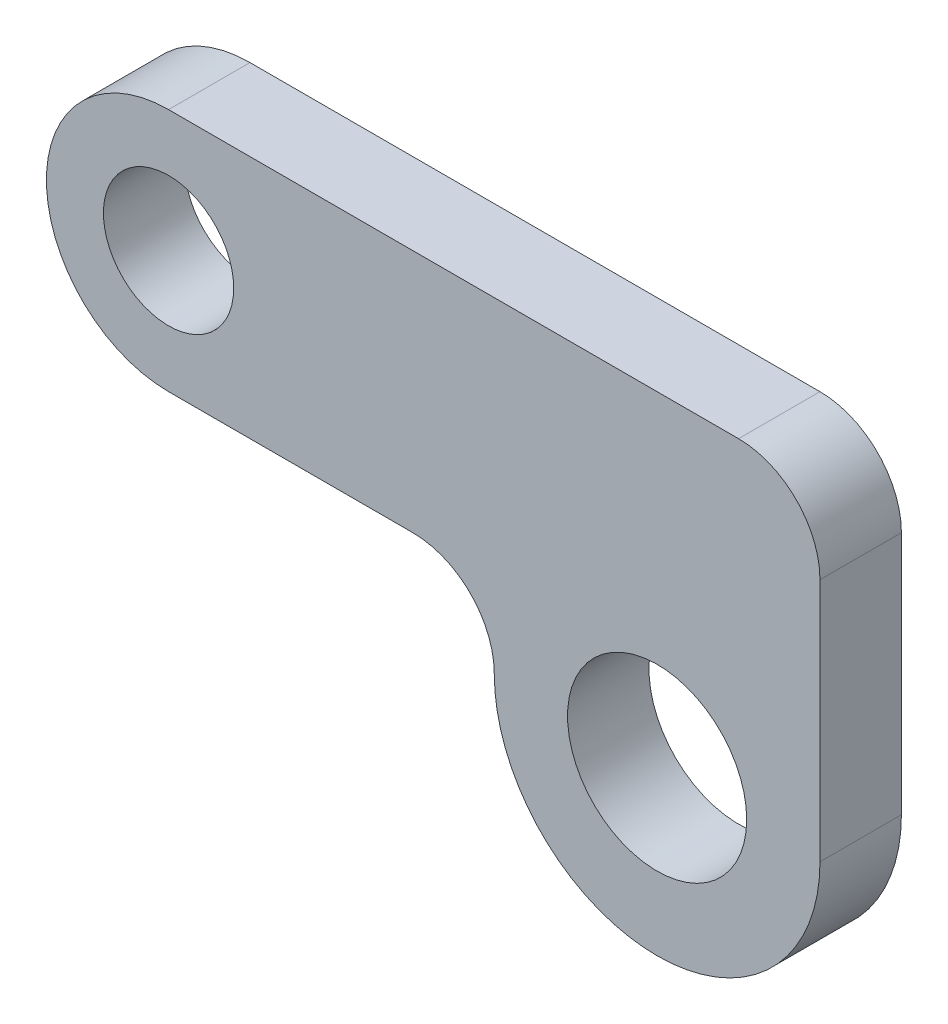
ISO-10303-21;
HEADER;
FILE_DESCRIPTION(('STEP AP214'),'2;1');
FILE_NAME('part.step','',(''),(''),'','','');
FILE_SCHEMA(('AUTOMOTIVE_DESIGN { 1 0 10303 214 1 1 1 1 }'));
ENDSEC;
DATA;
#1=APPLICATION_CONTEXT('core data for automotive mechanical design processes');
#2=APPLICATION_PROTOCOL_DEFINITION('international standard','automotive_design',2000,#1);
#3=PRODUCT_CONTEXT('',#1,'mechanical');
#4=PRODUCT('Part','Part','',(#3));
#5=PRODUCT_RELATED_PRODUCT_CATEGORY('part','',(#4));
#6=PRODUCT_DEFINITION_FORMATION('','',#4);
#7=PRODUCT_DEFINITION_CONTEXT('part definition',#1,'design');
#8=PRODUCT_DEFINITION('design','',#6,#7);
#9=PRODUCT_DEFINITION_SHAPE('','',#8);
#10=(LENGTH_UNIT() NAMED_UNIT(*) SI_UNIT(.MILLI.,.METRE.));
#11=(NAMED_UNIT(*) PLANE_ANGLE_UNIT() SI_UNIT($,.RADIAN.));
#12=(NAMED_UNIT(*) SI_UNIT($,.STERADIAN.) SOLID_ANGLE_UNIT());
#13=UNCERTAINTY_MEASURE_WITH_UNIT(LENGTH_MEASURE(1.E-05),#10,'distance_accuracy_value','');
#14=(GEOMETRIC_REPRESENTATION_CONTEXT(3) GLOBAL_UNCERTAINTY_ASSIGNED_CONTEXT((#13)) GLOBAL_UNIT_ASSIGNED_CONTEXT((#10,
#11,#12)) REPRESENTATION_CONTEXT('',''));
#15=CARTESIAN_POINT('',(0.,0.,0.));
#16=DIRECTION('',(0.,0.,1.));
#17=DIRECTION('',(1.,0.,0.));
#18=AXIS2_PLACEMENT_3D('',#15,#16,#17);
#19=CARTESIAN_POINT('',(-30.,0.,5.));
#20=DIRECTION('',(0.,0.,1.));
#21=DIRECTION('',(1.,0.,0.));
#22=AXIS2_PLACEMENT_3D('',#19,#20,#21);
#23=PLANE('',#22);
#24=CARTESIAN_POINT('',(-30.,0.,5.));
#25=DIRECTION('',(0.,0.,1.));
#26=DIRECTION('',(1.,0.,0.));
#27=AXIS2_PLACEMENT_3D('',#24,#25,#26);
#28=CIRCLE('',#27,4.);
#29=CARTESIAN_POINT('',(-26.,0.,5.));
#30=VERTEX_POINT('',#29);
#31=EDGE_CURVE('E173',#30,#30,#28,.T.);
#32=ORIENTED_EDGE('',*,*,#31,.F.);
#33=EDGE_LOOP('',(#32));
#34=FACE_BOUND('',#33,.T.);
#35=DIRECTION('',(0.,1.,0.));
#36=VECTOR('',#35,1.);
#37=CARTESIAN_POINT('',(10.,-12.5,5.));
#38=LINE('',#37,#36);
#39=CARTESIAN_POINT('',(10.,-12.5,5.));
#40=VERTEX_POINT('',#39);
#41=CARTESIAN_POINT('',(10.,2.5,5.));
#42=VERTEX_POINT('',#41);
#43=EDGE_CURVE('E164',#40,#42,#38,.T.);
#44=ORIENTED_EDGE('',*,*,#43,.T.);
#45=CARTESIAN_POINT('',(5.,2.5,5.));
#46=DIRECTION('',(0.,0.,1.));
#47=DIRECTION('',(1.,0.,0.));
#48=AXIS2_PLACEMENT_3D('',#45,#46,#47);
#49=CIRCLE('',#48,5.);
#50=CARTESIAN_POINT('',(5.,7.5,5.));
#51=VERTEX_POINT('',#50);
#52=EDGE_CURVE('E141',#42,#51,#49,.T.);
#53=ORIENTED_EDGE('',*,*,#52,.T.);
#54=DIRECTION('',(-1.,0.,0.));
#55=VECTOR('',#54,1.);
#56=CARTESIAN_POINT('',(-30.,7.5,5.));
#57=LINE('',#56,#55);
#58=CARTESIAN_POINT('',(-30.,7.5,5.));
#59=VERTEX_POINT('',#58);
#60=EDGE_CURVE('E113',#51,#59,#57,.T.);
#61=ORIENTED_EDGE('',*,*,#60,.T.);
#62=CARTESIAN_POINT('',(-30.,0.,5.));
#63=DIRECTION('',(0.,0.,1.));
#64=DIRECTION('',(1.,0.,0.));
#65=AXIS2_PLACEMENT_3D('',#62,#63,#64);
#66=CIRCLE('',#65,7.5);
#67=CARTESIAN_POINT('',(-30.,-7.5,5.));
#68=VERTEX_POINT('',#67);
#69=EDGE_CURVE('E108',#59,#68,#66,.T.);
#70=ORIENTED_EDGE('',*,*,#69,.T.);
#71=DIRECTION('',(1.,0.,0.));
#72=VECTOR('',#71,1.);
#73=CARTESIAN_POINT('',(-30.,-7.5,5.));
#74=LINE('',#73,#72);
#75=CARTESIAN_POINT('',(-15.,-7.5,5.));
#76=VERTEX_POINT('',#75);
#77=EDGE_CURVE('E98',#68,#76,#74,.T.);
#78=ORIENTED_EDGE('',*,*,#77,.T.);
#79=CARTESIAN_POINT('',(-15.,-12.5,5.));
#80=DIRECTION('',(0.,0.,1.));
#81=DIRECTION('',(1.,0.,0.));
#82=AXIS2_PLACEMENT_3D('',#79,#80,#81);
#83=CIRCLE('',#82,5.);
#84=CARTESIAN_POINT('',(-10.,-12.5,5.));
#85=VERTEX_POINT('',#84);
#86=EDGE_CURVE('E11',#76,#85,#83,.F.);
#87=ORIENTED_EDGE('',*,*,#86,.T.);
#88=CARTESIAN_POINT('',(0.,-12.5,5.));
#89=DIRECTION('',(0.,0.,1.));
#90=DIRECTION('',(1.,0.,0.));
#91=AXIS2_PLACEMENT_3D('',#88,#89,#90);
#92=CIRCLE('',#91,10.);
#93=EDGE_CURVE('E107',#85,#40,#92,.T.);
#94=ORIENTED_EDGE('',*,*,#93,.T.);
#95=EDGE_LOOP('',(#44,#53,#61,#70,#78,#87,#94));
#96=FACE_BOUND('',#95,.T.);
#97=CARTESIAN_POINT('',(0.,-12.5,5.));
#98=DIRECTION('',(0.,0.,1.));
#99=DIRECTION('',(1.,0.,0.));
#100=AXIS2_PLACEMENT_3D('',#97,#98,#99);
#101=CIRCLE('',#100,5.5);
#102=CARTESIAN_POINT('',(5.5,-12.5,5.));
#103=VERTEX_POINT('',#102);
#104=EDGE_CURVE('E219',#103,#103,#101,.T.);
#105=ORIENTED_EDGE('',*,*,#104,.F.);
#106=EDGE_LOOP('',(#105));
#107=FACE_BOUND('',#106,.T.);
#108=ADVANCED_FACE('F38',(#34,#96,#107),#23,.T.);
#109=CARTESIAN_POINT('',(-30.,0.,0.));
#110=DIRECTION('',(0.,0.,1.));
#111=DIRECTION('',(1.,0.,0.));
#112=AXIS2_PLACEMENT_3D('',#109,#110,#111);
#113=PLANE('',#112);
#114=DIRECTION('',(-1.,0.,0.));
#115=VECTOR('',#114,1.);
#116=CARTESIAN_POINT('',(-30.,7.5,0.));
#117=LINE('',#116,#115);
#118=CARTESIAN_POINT('',(5.,7.5,0.));
#119=VERTEX_POINT('',#118);
#120=CARTESIAN_POINT('',(-30.,7.5,0.));
#121=VERTEX_POINT('',#120);
#122=EDGE_CURVE('E118',#119,#121,#117,.T.);
#123=ORIENTED_EDGE('',*,*,#122,.F.);
#124=CARTESIAN_POINT('',(5.,2.5,0.));
#125=DIRECTION('',(0.,0.,1.));
#126=DIRECTION('',(1.,0.,0.));
#127=AXIS2_PLACEMENT_3D('',#124,#125,#126);
#128=CIRCLE('',#127,5.);
#129=CARTESIAN_POINT('',(10.,2.5,0.));
#130=VERTEX_POINT('',#129);
#131=EDGE_CURVE('E130',#119,#130,#128,.F.);
#132=ORIENTED_EDGE('',*,*,#131,.T.);
#133=DIRECTION('',(0.,1.,0.));
#134=VECTOR('',#133,1.);
#135=CARTESIAN_POINT('',(10.,-12.5,0.));
#136=LINE('',#135,#134);
#137=CARTESIAN_POINT('',(10.,-12.5,0.));
#138=VERTEX_POINT('',#137);
#139=EDGE_CURVE('E177',#138,#130,#136,.T.);
#140=ORIENTED_EDGE('',*,*,#139,.F.);
#141=CARTESIAN_POINT('',(0.,-12.5,0.));
#142=DIRECTION('',(0.,0.,1.));
#143=DIRECTION('',(1.,0.,0.));
#144=AXIS2_PLACEMENT_3D('',#141,#142,#143);
#145=CIRCLE('',#144,10.);
#146=CARTESIAN_POINT('',(-10.,-12.5,0.));
#147=VERTEX_POINT('',#146);
#148=EDGE_CURVE('E153',#147,#138,#145,.T.);
#149=ORIENTED_EDGE('',*,*,#148,.F.);
#150=CARTESIAN_POINT('',(-15.,-12.5,0.));
#151=DIRECTION('',(0.,0.,1.));
#152=DIRECTION('',(1.,0.,0.));
#153=AXIS2_PLACEMENT_3D('',#150,#151,#152);
#154=CIRCLE('',#153,5.);
#155=CARTESIAN_POINT('',(-15.,-7.5,0.));
#156=VERTEX_POINT('',#155);
#157=EDGE_CURVE('E47',#147,#156,#154,.T.);
#158=ORIENTED_EDGE('',*,*,#157,.T.);
#159=DIRECTION('',(1.,0.,0.));
#160=VECTOR('',#159,1.);
#161=CARTESIAN_POINT('',(-30.,-7.5,0.));
#162=LINE('',#161,#160);
#163=CARTESIAN_POINT('',(-30.,-7.5,0.));
#164=VERTEX_POINT('',#163);
#165=EDGE_CURVE('E151',#164,#156,#162,.T.);
#166=ORIENTED_EDGE('',*,*,#165,.F.);
#167=CARTESIAN_POINT('',(-30.,0.,0.));
#168=DIRECTION('',(0.,0.,1.));
#169=DIRECTION('',(1.,0.,0.));
#170=AXIS2_PLACEMENT_3D('',#167,#168,#169);
#171=CIRCLE('',#170,7.5);
#172=EDGE_CURVE('E122',#121,#164,#171,.T.);
#173=ORIENTED_EDGE('',*,*,#172,.F.);
#174=EDGE_LOOP('',(#123,#132,#140,#149,#158,#166,#173));
#175=FACE_BOUND('',#174,.T.);
#176=CARTESIAN_POINT('',(-30.,0.,0.));
#177=DIRECTION('',(0.,0.,1.));
#178=DIRECTION('',(1.,0.,0.));
#179=AXIS2_PLACEMENT_3D('',#176,#177,#178);
#180=CIRCLE('',#179,4.);
#181=CARTESIAN_POINT('',(-26.,0.,0.));
#182=VERTEX_POINT('',#181);
#183=EDGE_CURVE('E227',#182,#182,#180,.T.);
#184=ORIENTED_EDGE('',*,*,#183,.T.);
#185=EDGE_LOOP('',(#184));
#186=FACE_BOUND('',#185,.T.);
#187=CARTESIAN_POINT('',(0.,-12.5,0.));
#188=DIRECTION('',(0.,0.,1.));
#189=DIRECTION('',(1.,0.,0.));
#190=AXIS2_PLACEMENT_3D('',#187,#188,#189);
#191=CIRCLE('',#190,5.5);
#192=CARTESIAN_POINT('',(5.5,-12.5,0.));
#193=VERTEX_POINT('',#192);
#194=EDGE_CURVE('E222',#193,#193,#191,.T.);
#195=ORIENTED_EDGE('',*,*,#194,.T.);
#196=EDGE_LOOP('',(#195));
#197=FACE_BOUND('',#196,.T.);
#198=ADVANCED_FACE('F149',(#175,#186,#197),#113,.F.);
#199=CARTESIAN_POINT('',(-30.,0.,5.));
#200=DIRECTION('',(0.,0.,-1.));
#201=DIRECTION('',(-1.,0.,0.));
#202=AXIS2_PLACEMENT_3D('',#199,#200,#201);
#203=CYLINDRICAL_SURFACE('',#202,7.5);
#204=ORIENTED_EDGE('',*,*,#172,.T.);
#205=DIRECTION('',(0.,0.,-1.));
#206=VECTOR('',#205,1.);
#207=CARTESIAN_POINT('',(-30.,-7.5,5.));
#208=LINE('',#207,#206);
#209=EDGE_CURVE('E102',#68,#164,#208,.T.);
#210=ORIENTED_EDGE('',*,*,#209,.F.);
#211=ORIENTED_EDGE('',*,*,#69,.F.);
#212=DIRECTION('',(0.,0.,-1.));
#213=VECTOR('',#212,1.);
#214=CARTESIAN_POINT('',(-30.,7.5,5.));
#215=LINE('',#214,#213);
#216=EDGE_CURVE('E171',#59,#121,#215,.T.);
#217=ORIENTED_EDGE('',*,*,#216,.T.);
#218=EDGE_LOOP('',(#204,#210,#211,#217));
#219=FACE_BOUND('',#218,.T.);
#220=ADVANCED_FACE('F120',(#219),#203,.T.);
#221=CARTESIAN_POINT('',(-30.,-7.5,5.));
#222=DIRECTION('',(0.,1.,0.));
#223=DIRECTION('',(0.,0.,1.));
#224=AXIS2_PLACEMENT_3D('',#221,#222,#223);
#225=PLANE('',#224);
#226=ORIENTED_EDGE('',*,*,#165,.T.);
#227=DIRECTION('',(0.,0.,-1.));
#228=VECTOR('',#227,1.);
#229=CARTESIAN_POINT('',(-15.,-7.5,5.));
#230=LINE('',#229,#228);
#231=EDGE_CURVE('E54',#156,#76,#230,.F.);
#232=ORIENTED_EDGE('',*,*,#231,.T.);
#233=ORIENTED_EDGE('',*,*,#77,.F.);
#234=ORIENTED_EDGE('',*,*,#209,.T.);
#235=EDGE_LOOP('',(#226,#232,#233,#234));
#236=FACE_BOUND('',#235,.T.);
#237=ADVANCED_FACE('F100',(#236),#225,.F.);
#238=CARTESIAN_POINT('',(0.,-12.5,5.));
#239=DIRECTION('',(0.,0.,-1.));
#240=DIRECTION('',(-1.,0.,0.));
#241=AXIS2_PLACEMENT_3D('',#238,#239,#240);
#242=CYLINDRICAL_SURFACE('',#241,10.);
#243=ORIENTED_EDGE('',*,*,#148,.T.);
#244=DIRECTION('',(0.,0.,-1.));
#245=VECTOR('',#244,1.);
#246=CARTESIAN_POINT('',(10.,-12.5,5.));
#247=LINE('',#246,#245);
#248=EDGE_CURVE('E133',#40,#138,#247,.T.);
#249=ORIENTED_EDGE('',*,*,#248,.F.);
#250=ORIENTED_EDGE('',*,*,#93,.F.);
#251=DIRECTION('',(0.,0.,-1.));
#252=VECTOR('',#251,1.);
#253=CARTESIAN_POINT('',(-10.,-12.5,5.));
#254=LINE('',#253,#252);
#255=EDGE_CURVE('E125',#85,#147,#254,.T.);
#256=ORIENTED_EDGE('',*,*,#255,.T.);
#257=EDGE_LOOP('',(#243,#249,#250,#256));
#258=FACE_BOUND('',#257,.T.);
#259=ADVANCED_FACE('F161',(#258),#242,.T.);
#260=CARTESIAN_POINT('',(10.,-12.5,5.));
#261=DIRECTION('',(-1.,0.,0.));
#262=DIRECTION('',(0.,0.,1.));
#263=AXIS2_PLACEMENT_3D('',#260,#261,#262);
#264=PLANE('',#263);
#265=ORIENTED_EDGE('',*,*,#139,.T.);
#266=DIRECTION('',(0.,0.,-1.));
#267=VECTOR('',#266,1.);
#268=CARTESIAN_POINT('',(10.,2.5,5.));
#269=LINE('',#268,#267);
#270=EDGE_CURVE('E62',#130,#42,#269,.F.);
#271=ORIENTED_EDGE('',*,*,#270,.T.);
#272=ORIENTED_EDGE('',*,*,#43,.F.);
#273=ORIENTED_EDGE('',*,*,#248,.T.);
#274=EDGE_LOOP('',(#265,#271,#272,#273));
#275=FACE_BOUND('',#274,.T.);
#276=ADVANCED_FACE('F184',(#275),#264,.F.);
#277=CARTESIAN_POINT('',(-30.,7.5,5.));
#278=DIRECTION('',(0.,-1.,0.));
#279=DIRECTION('',(0.,0.,-1.));
#280=AXIS2_PLACEMENT_3D('',#277,#278,#279);
#281=PLANE('',#280);
#282=ORIENTED_EDGE('',*,*,#60,.F.);
#283=DIRECTION('',(0.,0.,-1.));
#284=VECTOR('',#283,1.);
#285=CARTESIAN_POINT('',(5.,7.5,5.));
#286=LINE('',#285,#284);
#287=EDGE_CURVE('E124',#51,#119,#286,.T.);
#288=ORIENTED_EDGE('',*,*,#287,.T.);
#289=ORIENTED_EDGE('',*,*,#122,.T.);
#290=ORIENTED_EDGE('',*,*,#216,.F.);
#291=EDGE_LOOP('',(#282,#288,#289,#290));
#292=FACE_BOUND('',#291,.T.);
#293=ADVANCED_FACE('F190',(#292),#281,.F.);
#294=CARTESIAN_POINT('',(-30.,0.,5.));
#295=DIRECTION('',(0.,0.,-1.));
#296=DIRECTION('',(-1.,0.,0.));
#297=AXIS2_PLACEMENT_3D('',#294,#295,#296);
#298=CYLINDRICAL_SURFACE('',#297,4.);
#299=ORIENTED_EDGE('',*,*,#31,.T.);
#300=EDGE_LOOP('',(#299));
#301=FACE_BOUND('',#300,.T.);
#302=ORIENTED_EDGE('',*,*,#183,.F.);
#303=EDGE_LOOP('',(#302));
#304=FACE_BOUND('',#303,.T.);
#305=ADVANCED_FACE('F192',(#301,#304),#298,.F.);
#306=CARTESIAN_POINT('',(0.,-12.5,5.));
#307=DIRECTION('',(0.,0.,-1.));
#308=DIRECTION('',(-1.,0.,0.));
#309=AXIS2_PLACEMENT_3D('',#306,#307,#308);
#310=CYLINDRICAL_SURFACE('',#309,5.5);
#311=ORIENTED_EDGE('',*,*,#104,.T.);
#312=EDGE_LOOP('',(#311));
#313=FACE_BOUND('',#312,.T.);
#314=ORIENTED_EDGE('',*,*,#194,.F.);
#315=EDGE_LOOP('',(#314));
#316=FACE_BOUND('',#315,.T.);
#317=ADVANCED_FACE('F198',(#313,#316),#310,.F.);
#318=CARTESIAN_POINT('',(5.,2.5,5.));
#319=DIRECTION('',(0.,0.,-1.));
#320=DIRECTION('',(-1.,0.,0.));
#321=AXIS2_PLACEMENT_3D('',#318,#319,#320);
#322=CYLINDRICAL_SURFACE('',#321,5.);
#323=ORIENTED_EDGE('',*,*,#52,.F.);
#324=ORIENTED_EDGE('',*,*,#270,.F.);
#325=ORIENTED_EDGE('',*,*,#131,.F.);
#326=ORIENTED_EDGE('',*,*,#287,.F.);
#327=EDGE_LOOP('',(#323,#324,#325,#326));
#328=FACE_BOUND('',#327,.T.);
#329=ADVANCED_FACE('F188',(#328),#322,.T.);
#330=CARTESIAN_POINT('',(-15.,-12.5,5.));
#331=DIRECTION('',(0.,0.,1.));
#332=DIRECTION('',(1.,0.,0.));
#333=AXIS2_PLACEMENT_3D('',#330,#331,#332);
#334=CYLINDRICAL_SURFACE('',#333,5.);
#335=ORIENTED_EDGE('',*,*,#86,.F.);
#336=ORIENTED_EDGE('',*,*,#231,.F.);
#337=ORIENTED_EDGE('',*,*,#157,.F.);
#338=ORIENTED_EDGE('',*,*,#255,.F.);
#339=EDGE_LOOP('',(#335,#336,#337,#338));
#340=FACE_BOUND('',#339,.T.);
#341=ADVANCED_FACE('F40',(#340),#334,.F.);
#342=CLOSED_SHELL('',(#108,#198,#220,#237,#259,#276,#293,#305,#317,#329,#341));
#343=MANIFOLD_SOLID_BREP('B2',#342);
#344=ADVANCED_BREP_SHAPE_REPRESENTATION('',(#18,#343),#14);
#345=SHAPE_DEFINITION_REPRESENTATION(#9,#344);
ENDSEC;
END-ISO-10303-21;
